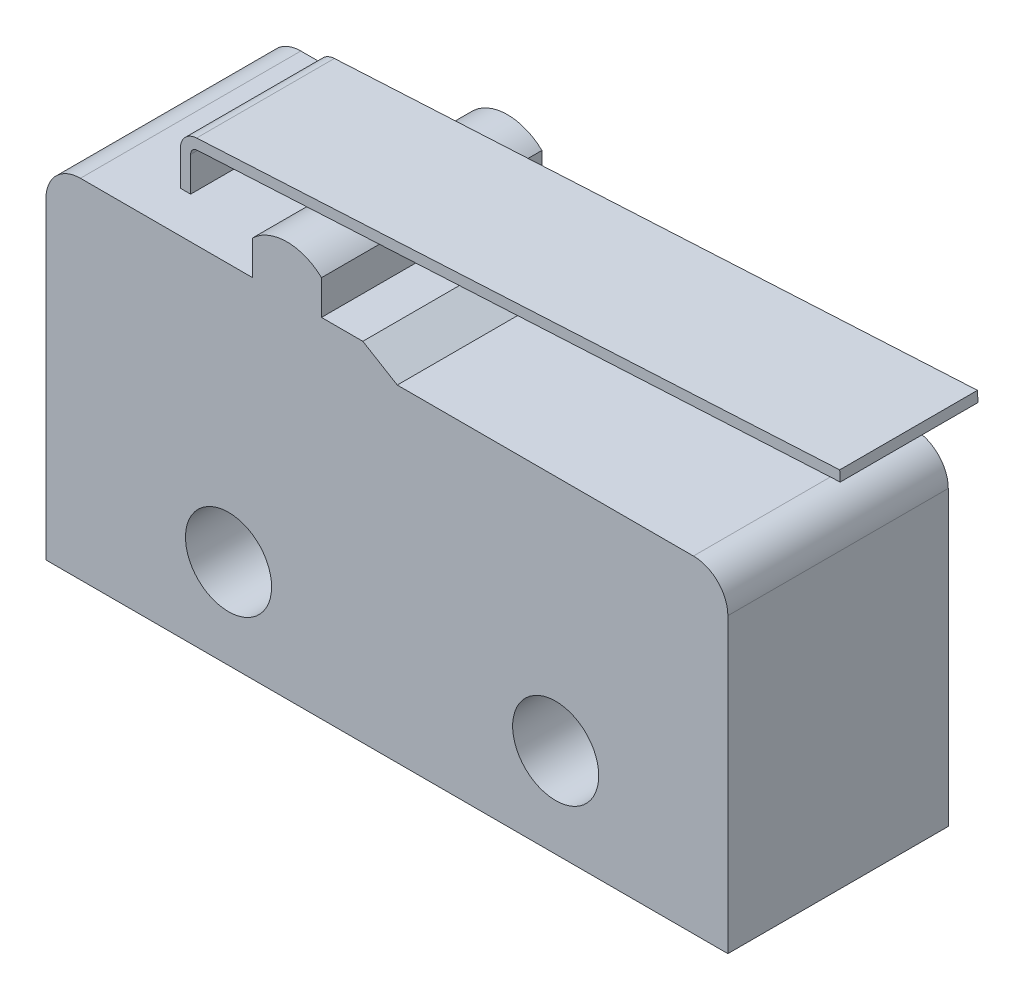
ISO-10303-21;
HEADER;
FILE_DESCRIPTION(('STEP AP214'),'2;1');
FILE_NAME('part.step','',(''),(''),'','','');
FILE_SCHEMA(('AUTOMOTIVE_DESIGN { 1 0 10303 214 1 1 1 1 }'));
ENDSEC;
DATA;
#1=APPLICATION_CONTEXT('core data for automotive mechanical design processes');
#2=APPLICATION_PROTOCOL_DEFINITION('international standard','automotive_design',2000,#1);
#3=PRODUCT_CONTEXT('',#1,'mechanical');
#4=PRODUCT('Part','Part','',(#3));
#5=PRODUCT_RELATED_PRODUCT_CATEGORY('part','',(#4));
#6=PRODUCT_DEFINITION_FORMATION('','',#4);
#7=PRODUCT_DEFINITION_CONTEXT('part definition',#1,'design');
#8=PRODUCT_DEFINITION('design','',#6,#7);
#9=PRODUCT_DEFINITION_SHAPE('','',#8);
#10=(LENGTH_UNIT() NAMED_UNIT(*) SI_UNIT(.MILLI.,.METRE.));
#11=(NAMED_UNIT(*) PLANE_ANGLE_UNIT() SI_UNIT($,.RADIAN.));
#12=(NAMED_UNIT(*) SI_UNIT($,.STERADIAN.) SOLID_ANGLE_UNIT());
#13=UNCERTAINTY_MEASURE_WITH_UNIT(LENGTH_MEASURE(1.E-05),#10,'distance_accuracy_value','');
#14=(GEOMETRIC_REPRESENTATION_CONTEXT(3) GLOBAL_UNCERTAINTY_ASSIGNED_CONTEXT((#13)) GLOBAL_UNIT_ASSIGNED_CONTEXT((#10,
#11,#12)) REPRESENTATION_CONTEXT('',''));
#15=CARTESIAN_POINT('',(0.,0.,0.));
#16=DIRECTION('',(0.,0.,1.));
#17=DIRECTION('',(1.,0.,0.));
#18=AXIS2_PLACEMENT_3D('',#15,#16,#17);
#19=CARTESIAN_POINT('',(-2.11060404683769,8.69971868763504,2.));
#20=DIRECTION('',(-0.0530202341884263,0.998593438175219,0.));
#21=DIRECTION('',(-0.998593438175219,-0.0530202341884263,0.));
#22=AXIS2_PLACEMENT_3D('',#19,#20,#21);
#23=PLANE('',#22);
#24=DIRECTION('',(0.998593438175219,0.0530202341884263,0.));
#25=VECTOR('',#24,1.);
#26=CARTESIAN_POINT('',(-2.11060404683769,8.69971868763504,-2.));
#27=LINE('',#26,#25);
#28=CARTESIAN_POINT('',(-2.11060404683769,8.69971868763504,-2.));
#29=VERTEX_POINT('',#28);
#30=CARTESIAN_POINT('',(16.5630932470389,9.69119706695862,-2.));
#31=VERTEX_POINT('',#30);
#32=EDGE_CURVE('E140',#29,#31,#27,.T.);
#33=ORIENTED_EDGE('',*,*,#32,.T.);
#34=DIRECTION('',(0.,0.,-1.));
#35=VECTOR('',#34,1.);
#36=CARTESIAN_POINT('',(16.5630932470389,9.69119706695862,2.));
#37=LINE('',#36,#35);
#38=CARTESIAN_POINT('',(16.5630932470389,9.69119706695862,2.));
#39=VERTEX_POINT('',#38);
#40=EDGE_CURVE('E12',#39,#31,#37,.T.);
#41=ORIENTED_EDGE('',*,*,#40,.F.);
#42=DIRECTION('',(0.998593438175219,0.0530202341884263,0.));
#43=VECTOR('',#42,1.);
#44=CARTESIAN_POINT('',(-2.11060404683769,8.69971868763504,2.));
#45=LINE('',#44,#43);
#46=CARTESIAN_POINT('',(-2.11060404683769,8.69971868763504,2.));
#47=VERTEX_POINT('',#46);
#48=EDGE_CURVE('E98',#47,#39,#45,.T.);
#49=ORIENTED_EDGE('',*,*,#48,.F.);
#50=DIRECTION('',(0.,0.,-1.));
#51=VECTOR('',#50,1.);
#52=CARTESIAN_POINT('',(-2.11060404683769,8.69971868763504,2.));
#53=LINE('',#52,#51);
#54=EDGE_CURVE('E139',#47,#29,#53,.T.);
#55=ORIENTED_EDGE('',*,*,#54,.T.);
#56=EDGE_LOOP('',(#33,#41,#49,#55));
#57=FACE_BOUND('',#56,.T.);
#58=ADVANCED_FACE('F43',(#57),#23,.F.);
#59=CARTESIAN_POINT('',(16.5471871767824,9.99077509841118,2.));
#60=DIRECTION('',(0.99859343817522,0.0530202341883963,0.));
#61=DIRECTION('',(-0.0530202341883963,0.99859343817522,0.));
#62=AXIS2_PLACEMENT_3D('',#59,#60,#61);
#63=PLANE('',#62);
#64=DIRECTION('',(0.0530202341883963,-0.99859343817522,0.));
#65=VECTOR('',#64,1.);
#66=CARTESIAN_POINT('',(16.5471871767824,9.99077509841118,-2.));
#67=LINE('',#66,#65);
#68=CARTESIAN_POINT('',(16.5471871767824,9.99077509841118,-2.));
#69=VERTEX_POINT('',#68);
#70=EDGE_CURVE('E143',#69,#31,#67,.T.);
#71=ORIENTED_EDGE('',*,*,#70,.F.);
#72=DIRECTION('',(0.,0.,-1.));
#73=VECTOR('',#72,1.);
#74=CARTESIAN_POINT('',(16.5471871767824,9.99077509841118,2.));
#75=LINE('',#74,#73);
#76=CARTESIAN_POINT('',(16.5471871767824,9.99077509841118,2.));
#77=VERTEX_POINT('',#76);
#78=EDGE_CURVE('E51',#77,#69,#75,.T.);
#79=ORIENTED_EDGE('',*,*,#78,.F.);
#80=DIRECTION('',(0.0530202341883963,-0.99859343817522,0.));
#81=VECTOR('',#80,1.);
#82=CARTESIAN_POINT('',(16.5471871767824,9.99077509841118,2.));
#83=LINE('',#82,#81);
#84=EDGE_CURVE('E182',#77,#39,#83,.T.);
#85=ORIENTED_EDGE('',*,*,#84,.T.);
#86=ORIENTED_EDGE('',*,*,#40,.T.);
#87=EDGE_LOOP('',(#71,#79,#85,#86));
#88=FACE_BOUND('',#87,.T.);
#89=ADVANCED_FACE('F173',(#88),#63,.T.);
#90=CARTESIAN_POINT('',(-2.12651011709421,8.99929671908761,2.));
#91=DIRECTION('',(-0.0530202341884263,0.998593438175219,0.));
#92=DIRECTION('',(-0.998593438175219,-0.0530202341884263,0.));
#93=AXIS2_PLACEMENT_3D('',#90,#91,#92);
#94=PLANE('',#93);
#95=DIRECTION('',(0.998593438175219,0.0530202341884263,0.));
#96=VECTOR('',#95,1.);
#97=CARTESIAN_POINT('',(-2.12651011709421,8.99929671908761,-2.));
#98=LINE('',#97,#96);
#99=CARTESIAN_POINT('',(-2.12651011709421,8.99929671908761,-2.));
#100=VERTEX_POINT('',#99);
#101=EDGE_CURVE('E146',#100,#69,#98,.T.);
#102=ORIENTED_EDGE('',*,*,#101,.F.);
#103=DIRECTION('',(0.,0.,-1.));
#104=VECTOR('',#103,1.);
#105=CARTESIAN_POINT('',(-2.12651011709421,8.99929671908761,2.));
#106=LINE('',#105,#104);
#107=CARTESIAN_POINT('',(-2.12651011709421,8.99929671908761,2.));
#108=VERTEX_POINT('',#107);
#109=EDGE_CURVE('E163',#108,#100,#106,.T.);
#110=ORIENTED_EDGE('',*,*,#109,.F.);
#111=DIRECTION('',(0.998593438175219,0.0530202341884263,0.));
#112=VECTOR('',#111,1.);
#113=CARTESIAN_POINT('',(-2.12651011709421,8.99929671908761,2.));
#114=LINE('',#113,#112);
#115=EDGE_CURVE('E170',#108,#77,#114,.T.);
#116=ORIENTED_EDGE('',*,*,#115,.T.);
#117=ORIENTED_EDGE('',*,*,#78,.T.);
#118=EDGE_LOOP('',(#102,#110,#116,#117));
#119=FACE_BOUND('',#118,.T.);
#120=ADVANCED_FACE('F168',(#119),#94,.T.);
#121=CARTESIAN_POINT('',(-2.1,8.5,2.));
#122=DIRECTION('',(0.,0.,-1.));
#123=DIRECTION('',(-1.,0.,0.));
#124=AXIS2_PLACEMENT_3D('',#121,#122,#123);
#125=CYLINDRICAL_SURFACE('',#124,0.5);
#126=CARTESIAN_POINT('',(-2.1,8.5,-2.));
#127=DIRECTION('',(0.,0.,1.));
#128=DIRECTION('',(1.,0.,0.));
#129=AXIS2_PLACEMENT_3D('',#126,#127,#128);
#130=CIRCLE('',#129,0.5);
#131=CARTESIAN_POINT('',(-2.6,8.5,-2.));
#132=VERTEX_POINT('',#131);
#133=EDGE_CURVE('E149',#132,#100,#130,.F.);
#134=ORIENTED_EDGE('',*,*,#133,.F.);
#135=DIRECTION('',(0.,0.,-1.));
#136=VECTOR('',#135,1.);
#137=CARTESIAN_POINT('',(-2.6,8.5,2.));
#138=LINE('',#137,#136);
#139=CARTESIAN_POINT('',(-2.6,8.5,2.));
#140=VERTEX_POINT('',#139);
#141=EDGE_CURVE('E161',#140,#132,#138,.T.);
#142=ORIENTED_EDGE('',*,*,#141,.F.);
#143=CARTESIAN_POINT('',(-2.1,8.5,2.));
#144=DIRECTION('',(0.,0.,1.));
#145=DIRECTION('',(1.,0.,0.));
#146=AXIS2_PLACEMENT_3D('',#143,#144,#145);
#147=CIRCLE('',#146,0.5);
#148=EDGE_CURVE('E134',#140,#108,#147,.F.);
#149=ORIENTED_EDGE('',*,*,#148,.T.);
#150=ORIENTED_EDGE('',*,*,#109,.T.);
#151=EDGE_LOOP('',(#134,#142,#149,#150));
#152=FACE_BOUND('',#151,.T.);
#153=ADVANCED_FACE('F180',(#152),#125,.T.);
#154=CARTESIAN_POINT('',(-2.6,7.5,2.));
#155=DIRECTION('',(-1.,0.,0.));
#156=DIRECTION('',(0.,0.,1.));
#157=AXIS2_PLACEMENT_3D('',#154,#155,#156);
#158=PLANE('',#157);
#159=DIRECTION('',(0.,1.,0.));
#160=VECTOR('',#159,1.);
#161=CARTESIAN_POINT('',(-2.6,7.5,-2.));
#162=LINE('',#161,#160);
#163=CARTESIAN_POINT('',(-2.6,7.5,-2.));
#164=VERTEX_POINT('',#163);
#165=EDGE_CURVE('E152',#164,#132,#162,.T.);
#166=ORIENTED_EDGE('',*,*,#165,.F.);
#167=DIRECTION('',(0.,0.,-1.));
#168=VECTOR('',#167,1.);
#169=CARTESIAN_POINT('',(-2.6,7.5,2.));
#170=LINE('',#169,#168);
#171=CARTESIAN_POINT('',(-2.6,7.5,2.));
#172=VERTEX_POINT('',#171);
#173=EDGE_CURVE('E122',#172,#164,#170,.T.);
#174=ORIENTED_EDGE('',*,*,#173,.F.);
#175=DIRECTION('',(0.,1.,0.));
#176=VECTOR('',#175,1.);
#177=CARTESIAN_POINT('',(-2.6,7.5,2.));
#178=LINE('',#177,#176);
#179=EDGE_CURVE('E132',#172,#140,#178,.T.);
#180=ORIENTED_EDGE('',*,*,#179,.T.);
#181=ORIENTED_EDGE('',*,*,#141,.T.);
#182=EDGE_LOOP('',(#166,#174,#180,#181));
#183=FACE_BOUND('',#182,.T.);
#184=ADVANCED_FACE('F187',(#183),#158,.T.);
#185=CARTESIAN_POINT('',(-2.3,7.5,2.));
#186=DIRECTION('',(0.,-1.,0.));
#187=DIRECTION('',(0.,0.,-1.));
#188=AXIS2_PLACEMENT_3D('',#185,#186,#187);
#189=PLANE('',#188);
#190=DIRECTION('',(-1.,0.,0.));
#191=VECTOR('',#190,1.);
#192=CARTESIAN_POINT('',(-2.3,7.5,-2.));
#193=LINE('',#192,#191);
#194=CARTESIAN_POINT('',(-2.3,7.5,-2.));
#195=VERTEX_POINT('',#194);
#196=EDGE_CURVE('E121',#195,#164,#193,.T.);
#197=ORIENTED_EDGE('',*,*,#196,.F.);
#198=DIRECTION('',(0.,0.,-1.));
#199=VECTOR('',#198,1.);
#200=CARTESIAN_POINT('',(-2.3,7.5,2.));
#201=LINE('',#200,#199);
#202=CARTESIAN_POINT('',(-2.3,7.5,2.));
#203=VERTEX_POINT('',#202);
#204=EDGE_CURVE('E115',#203,#195,#201,.T.);
#205=ORIENTED_EDGE('',*,*,#204,.F.);
#206=DIRECTION('',(-1.,0.,0.));
#207=VECTOR('',#206,1.);
#208=CARTESIAN_POINT('',(-2.3,7.5,2.));
#209=LINE('',#208,#207);
#210=EDGE_CURVE('E119',#203,#172,#209,.T.);
#211=ORIENTED_EDGE('',*,*,#210,.T.);
#212=ORIENTED_EDGE('',*,*,#173,.T.);
#213=EDGE_LOOP('',(#197,#205,#211,#212));
#214=FACE_BOUND('',#213,.T.);
#215=ADVANCED_FACE('F117',(#214),#189,.T.);
#216=CARTESIAN_POINT('',(-2.3,7.5,2.));
#217=DIRECTION('',(-1.,0.,0.));
#218=DIRECTION('',(0.,0.,1.));
#219=AXIS2_PLACEMENT_3D('',#216,#217,#218);
#220=PLANE('',#219);
#221=DIRECTION('',(0.,1.,0.));
#222=VECTOR('',#221,1.);
#223=CARTESIAN_POINT('',(-2.3,7.5,-2.));
#224=LINE('',#223,#222);
#225=CARTESIAN_POINT('',(-2.3,8.5,-2.));
#226=VERTEX_POINT('',#225);
#227=EDGE_CURVE('E86',#195,#226,#224,.T.);
#228=ORIENTED_EDGE('',*,*,#227,.T.);
#229=DIRECTION('',(0.,0.,-1.));
#230=VECTOR('',#229,1.);
#231=CARTESIAN_POINT('',(-2.3,8.5,2.));
#232=LINE('',#231,#230);
#233=CARTESIAN_POINT('',(-2.3,8.5,2.));
#234=VERTEX_POINT('',#233);
#235=EDGE_CURVE('E123',#234,#226,#232,.T.);
#236=ORIENTED_EDGE('',*,*,#235,.F.);
#237=DIRECTION('',(0.,1.,0.));
#238=VECTOR('',#237,1.);
#239=CARTESIAN_POINT('',(-2.3,7.5,2.));
#240=LINE('',#239,#238);
#241=EDGE_CURVE('E125',#203,#234,#240,.T.);
#242=ORIENTED_EDGE('',*,*,#241,.F.);
#243=ORIENTED_EDGE('',*,*,#204,.T.);
#244=EDGE_LOOP('',(#228,#236,#242,#243));
#245=FACE_BOUND('',#244,.T.);
#246=ADVANCED_FACE('F126',(#245),#220,.F.);
#247=CARTESIAN_POINT('',(-2.1,8.5,2.));
#248=DIRECTION('',(0.,0.,-1.));
#249=DIRECTION('',(-1.,0.,0.));
#250=AXIS2_PLACEMENT_3D('',#247,#248,#249);
#251=CYLINDRICAL_SURFACE('',#250,0.2);
#252=CARTESIAN_POINT('',(-2.1,8.5,-2.));
#253=DIRECTION('',(0.,0.,-1.));
#254=DIRECTION('',(-1.,0.,0.));
#255=AXIS2_PLACEMENT_3D('',#252,#253,#254);
#256=CIRCLE('',#255,0.2);
#257=EDGE_CURVE('E92',#226,#29,#256,.T.);
#258=ORIENTED_EDGE('',*,*,#257,.T.);
#259=ORIENTED_EDGE('',*,*,#54,.F.);
#260=CARTESIAN_POINT('',(-2.1,8.5,2.));
#261=DIRECTION('',(0.,0.,-1.));
#262=DIRECTION('',(-1.,0.,0.));
#263=AXIS2_PLACEMENT_3D('',#260,#261,#262);
#264=CIRCLE('',#263,0.2);
#265=EDGE_CURVE('E59',#234,#47,#264,.T.);
#266=ORIENTED_EDGE('',*,*,#265,.F.);
#267=ORIENTED_EDGE('',*,*,#235,.T.);
#268=EDGE_LOOP('',(#258,#259,#266,#267));
#269=FACE_BOUND('',#268,.T.);
#270=ADVANCED_FACE('F189',(#269),#251,.F.);
#271=CARTESIAN_POINT('',(-2.1,8.5,2.));
#272=DIRECTION('',(0.,0.,1.));
#273=DIRECTION('',(1.,0.,0.));
#274=AXIS2_PLACEMENT_3D('',#271,#272,#273);
#275=PLANE('',#274);
#276=ORIENTED_EDGE('',*,*,#48,.T.);
#277=ORIENTED_EDGE('',*,*,#84,.F.);
#278=ORIENTED_EDGE('',*,*,#115,.F.);
#279=ORIENTED_EDGE('',*,*,#148,.F.);
#280=ORIENTED_EDGE('',*,*,#179,.F.);
#281=ORIENTED_EDGE('',*,*,#210,.F.);
#282=ORIENTED_EDGE('',*,*,#241,.T.);
#283=ORIENTED_EDGE('',*,*,#265,.T.);
#284=EDGE_LOOP('',(#276,#277,#278,#279,#280,#281,#282,#283));
#285=FACE_BOUND('',#284,.T.);
#286=ADVANCED_FACE('F129',(#285),#275,.T.);
#287=CARTESIAN_POINT('',(-2.1,8.5,-2.));
#288=DIRECTION('',(0.,0.,1.));
#289=DIRECTION('',(1.,0.,0.));
#290=AXIS2_PLACEMENT_3D('',#287,#288,#289);
#291=PLANE('',#290);
#292=ORIENTED_EDGE('',*,*,#32,.F.);
#293=ORIENTED_EDGE('',*,*,#257,.F.);
#294=ORIENTED_EDGE('',*,*,#227,.F.);
#295=ORIENTED_EDGE('',*,*,#196,.T.);
#296=ORIENTED_EDGE('',*,*,#165,.T.);
#297=ORIENTED_EDGE('',*,*,#133,.T.);
#298=ORIENTED_EDGE('',*,*,#101,.T.);
#299=ORIENTED_EDGE('',*,*,#70,.T.);
#300=EDGE_LOOP('',(#292,#293,#294,#295,#296,#297,#298,#299));
#301=FACE_BOUND('',#300,.T.);
#302=ADVANCED_FACE('F176',(#301),#291,.F.);
#303=CLOSED_SHELL('',(#58,#89,#120,#153,#184,#215,#246,#270,#286,#302));
#304=MANIFOLD_SOLID_BREP('B2',#303);
#305=CARTESIAN_POINT('',(13.5,5.9,3.2));
#306=DIRECTION('',(0.,0.,1.));
#307=DIRECTION('',(1.,0.,0.));
#308=AXIS2_PLACEMENT_3D('',#305,#306,#307);
#309=PLANE('',#308);
#310=CARTESIAN_POINT('',(0.,0.,3.2));
#311=DIRECTION('',(0.,0.,1.));
#312=DIRECTION('',(1.,0.,0.));
#313=AXIS2_PLACEMENT_3D('',#310,#311,#312);
#314=CIRCLE('',#313,1.25);
#315=CARTESIAN_POINT('',(1.25,0.,3.2));
#316=VERTEX_POINT('',#315);
#317=EDGE_CURVE('E396',#316,#316,#314,.T.);
#318=ORIENTED_EDGE('',*,*,#317,.F.);
#319=EDGE_LOOP('',(#318));
#320=FACE_BOUND('',#319,.T.);
#321=DIRECTION('',(0.,1.,0.));
#322=VECTOR('',#321,1.);
#323=CARTESIAN_POINT('',(14.5,-2.6,3.2));
#324=LINE('',#323,#322);
#325=CARTESIAN_POINT('',(14.5,-2.6,3.2));
#326=VERTEX_POINT('',#325);
#327=CARTESIAN_POINT('',(14.5,5.9,3.2));
#328=VERTEX_POINT('',#327);
#329=EDGE_CURVE('E415',#326,#328,#324,.T.);
#330=ORIENTED_EDGE('',*,*,#329,.T.);
#331=CARTESIAN_POINT('',(13.5,5.9,3.2));
#332=DIRECTION('',(0.,0.,1.));
#333=DIRECTION('',(1.,0.,0.));
#334=AXIS2_PLACEMENT_3D('',#331,#332,#333);
#335=CIRCLE('',#334,1.);
#336=CARTESIAN_POINT('',(13.5,6.9,3.2));
#337=VERTEX_POINT('',#336);
#338=EDGE_CURVE('E343',#328,#337,#335,.T.);
#339=ORIENTED_EDGE('',*,*,#338,.T.);
#340=DIRECTION('',(-1.,0.,0.));
#341=VECTOR('',#340,1.);
#342=CARTESIAN_POINT('',(13.5,6.9,3.2));
#343=LINE('',#342,#341);
#344=CARTESIAN_POINT('',(4.9,6.9,3.2));
#345=VERTEX_POINT('',#344);
#346=EDGE_CURVE('E442',#337,#345,#343,.T.);
#347=ORIENTED_EDGE('',*,*,#346,.T.);
#348=DIRECTION('',(-0.857492925712544,0.514495755427527,0.));
#349=VECTOR('',#348,1.);
#350=CARTESIAN_POINT('',(4.9,6.9,3.2));
#351=LINE('',#350,#349);
#352=CARTESIAN_POINT('',(3.9,7.5,3.2));
#353=VERTEX_POINT('',#352);
#354=EDGE_CURVE('E461',#345,#353,#351,.T.);
#355=ORIENTED_EDGE('',*,*,#354,.T.);
#356=DIRECTION('',(-1.,0.,0.));
#357=VECTOR('',#356,1.);
#358=CARTESIAN_POINT('',(3.9,7.5,3.2));
#359=LINE('',#358,#357);
#360=CARTESIAN_POINT('',(2.7,7.5,3.2));
#361=VERTEX_POINT('',#360);
#362=EDGE_CURVE('E458',#353,#361,#359,.T.);
#363=ORIENTED_EDGE('',*,*,#362,.T.);
#364=DIRECTION('',(0.,1.,0.));
#365=VECTOR('',#364,1.);
#366=CARTESIAN_POINT('',(2.7,7.5,3.2));
#367=LINE('',#366,#365);
#368=CARTESIAN_POINT('',(2.7,8.5,3.2));
#369=VERTEX_POINT('',#368);
#370=EDGE_CURVE('E460',#361,#369,#367,.T.);
#371=ORIENTED_EDGE('',*,*,#370,.T.);
#372=CARTESIAN_POINT('',(1.7,7.45,3.2));
#373=DIRECTION('',(0.,0.,1.));
#374=DIRECTION('',(1.,0.,0.));
#375=AXIS2_PLACEMENT_3D('',#372,#373,#374);
#376=CIRCLE('',#375,1.45);
#377=CARTESIAN_POINT('',(0.699999999999999,8.5,3.2));
#378=VERTEX_POINT('',#377);
#379=EDGE_CURVE('E463',#369,#378,#376,.T.);
#380=ORIENTED_EDGE('',*,*,#379,.T.);
#381=DIRECTION('',(0.,-1.,0.));
#382=VECTOR('',#381,1.);
#383=CARTESIAN_POINT('',(0.699999999999999,8.5,3.2));
#384=LINE('',#383,#382);
#385=CARTESIAN_POINT('',(0.699999999999999,7.5,3.2));
#386=VERTEX_POINT('',#385);
#387=EDGE_CURVE('E469',#378,#386,#384,.T.);
#388=ORIENTED_EDGE('',*,*,#387,.T.);
#389=DIRECTION('',(-1.,0.,0.));
#390=VECTOR('',#389,1.);
#391=CARTESIAN_POINT('',(0.699999999999999,7.5,3.2));
#392=LINE('',#391,#390);
#393=CARTESIAN_POINT('',(-4.3,7.5,3.2));
#394=VERTEX_POINT('',#393);
#395=EDGE_CURVE('E374',#386,#394,#392,.T.);
#396=ORIENTED_EDGE('',*,*,#395,.T.);
#397=CARTESIAN_POINT('',(-4.3,6.5,3.2));
#398=DIRECTION('',(0.,0.,1.));
#399=DIRECTION('',(1.,0.,0.));
#400=AXIS2_PLACEMENT_3D('',#397,#398,#399);
#401=CIRCLE('',#400,1.);
#402=CARTESIAN_POINT('',(-5.3,6.5,3.2));
#403=VERTEX_POINT('',#402);
#404=EDGE_CURVE('E368',#394,#403,#401,.T.);
#405=ORIENTED_EDGE('',*,*,#404,.T.);
#406=DIRECTION('',(0.,-1.,0.));
#407=VECTOR('',#406,1.);
#408=CARTESIAN_POINT('',(-5.3,6.5,3.2));
#409=LINE('',#408,#407);
#410=CARTESIAN_POINT('',(-5.3,-2.6,3.2));
#411=VERTEX_POINT('',#410);
#412=EDGE_CURVE('E372',#403,#411,#409,.T.);
#413=ORIENTED_EDGE('',*,*,#412,.T.);
#414=DIRECTION('',(1.,0.,0.));
#415=VECTOR('',#414,1.);
#416=CARTESIAN_POINT('',(-5.3,-2.6,3.2));
#417=LINE('',#416,#415);
#418=EDGE_CURVE('E288',#411,#326,#417,.T.);
#419=ORIENTED_EDGE('',*,*,#418,.T.);
#420=EDGE_LOOP('',(#330,#339,#347,#355,#363,#371,#380,#388,#396,#405,#413,#419));
#421=FACE_BOUND('',#420,.T.);
#422=CARTESIAN_POINT('',(9.5,0.,3.2));
#423=DIRECTION('',(0.,0.,1.));
#424=DIRECTION('',(1.,0.,0.));
#425=AXIS2_PLACEMENT_3D('',#422,#423,#424);
#426=CIRCLE('',#425,1.25);
#427=CARTESIAN_POINT('',(10.75,0.,3.2));
#428=VERTEX_POINT('',#427);
#429=EDGE_CURVE('E512',#428,#428,#426,.T.);
#430=ORIENTED_EDGE('',*,*,#429,.F.);
#431=EDGE_LOOP('',(#430));
#432=FACE_BOUND('',#431,.T.);
#433=ADVANCED_FACE('F271',(#320,#421,#432),#309,.T.);
#434=CARTESIAN_POINT('',(13.5,5.9,-3.2));
#435=DIRECTION('',(0.,0.,1.));
#436=DIRECTION('',(1.,0.,0.));
#437=AXIS2_PLACEMENT_3D('',#434,#435,#436);
#438=PLANE('',#437);
#439=CARTESIAN_POINT('',(0.,0.,-3.2));
#440=DIRECTION('',(0.,0.,1.));
#441=DIRECTION('',(1.,0.,0.));
#442=AXIS2_PLACEMENT_3D('',#439,#440,#441);
#443=CIRCLE('',#442,1.25);
#444=CARTESIAN_POINT('',(1.25,0.,-3.2));
#445=VERTEX_POINT('',#444);
#446=EDGE_CURVE('E517',#445,#445,#443,.T.);
#447=ORIENTED_EDGE('',*,*,#446,.T.);
#448=EDGE_LOOP('',(#447));
#449=FACE_BOUND('',#448,.T.);
#450=DIRECTION('',(0.,1.,0.));
#451=VECTOR('',#450,1.);
#452=CARTESIAN_POINT('',(14.5,-2.6,-3.2));
#453=LINE('',#452,#451);
#454=CARTESIAN_POINT('',(14.5,-2.6,-3.2));
#455=VERTEX_POINT('',#454);
#456=CARTESIAN_POINT('',(14.5,5.9,-3.2));
#457=VERTEX_POINT('',#456);
#458=EDGE_CURVE('E392',#455,#457,#453,.T.);
#459=ORIENTED_EDGE('',*,*,#458,.F.);
#460=DIRECTION('',(1.,0.,0.));
#461=VECTOR('',#460,1.);
#462=CARTESIAN_POINT('',(-5.3,-2.6,-3.2));
#463=LINE('',#462,#461);
#464=CARTESIAN_POINT('',(-5.3,-2.6,-3.2));
#465=VERTEX_POINT('',#464);
#466=EDGE_CURVE('E335',#465,#455,#463,.T.);
#467=ORIENTED_EDGE('',*,*,#466,.F.);
#468=DIRECTION('',(0.,-1.,0.));
#469=VECTOR('',#468,1.);
#470=CARTESIAN_POINT('',(-5.3,6.5,-3.2));
#471=LINE('',#470,#469);
#472=CARTESIAN_POINT('',(-5.3,6.5,-3.2));
#473=VERTEX_POINT('',#472);
#474=EDGE_CURVE('E329',#473,#465,#471,.T.);
#475=ORIENTED_EDGE('',*,*,#474,.F.);
#476=CARTESIAN_POINT('',(-4.3,6.5,-3.2));
#477=DIRECTION('',(0.,0.,1.));
#478=DIRECTION('',(1.,0.,0.));
#479=AXIS2_PLACEMENT_3D('',#476,#477,#478);
#480=CIRCLE('',#479,1.);
#481=CARTESIAN_POINT('',(-4.3,7.5,-3.2));
#482=VERTEX_POINT('',#481);
#483=EDGE_CURVE('E382',#482,#473,#480,.T.);
#484=ORIENTED_EDGE('',*,*,#483,.F.);
#485=DIRECTION('',(-1.,0.,0.));
#486=VECTOR('',#485,1.);
#487=CARTESIAN_POINT('',(0.699999999999999,7.5,-3.2));
#488=LINE('',#487,#486);
#489=CARTESIAN_POINT('',(0.699999999999999,7.5,-3.2));
#490=VERTEX_POINT('',#489);
#491=EDGE_CURVE('E410',#490,#482,#488,.T.);
#492=ORIENTED_EDGE('',*,*,#491,.F.);
#493=DIRECTION('',(0.,-1.,0.));
#494=VECTOR('',#493,1.);
#495=CARTESIAN_POINT('',(0.699999999999999,8.5,-3.2));
#496=LINE('',#495,#494);
#497=CARTESIAN_POINT('',(0.699999999999999,8.5,-3.2));
#498=VERTEX_POINT('',#497);
#499=EDGE_CURVE('E408',#498,#490,#496,.T.);
#500=ORIENTED_EDGE('',*,*,#499,.F.);
#501=CARTESIAN_POINT('',(1.7,7.45,-3.2));
#502=DIRECTION('',(0.,0.,1.));
#503=DIRECTION('',(1.,0.,0.));
#504=AXIS2_PLACEMENT_3D('',#501,#502,#503);
#505=CIRCLE('',#504,1.45);
#506=CARTESIAN_POINT('',(2.7,8.5,-3.2));
#507=VERTEX_POINT('',#506);
#508=EDGE_CURVE('E406',#507,#498,#505,.T.);
#509=ORIENTED_EDGE('',*,*,#508,.F.);
#510=DIRECTION('',(0.,1.,0.));
#511=VECTOR('',#510,1.);
#512=CARTESIAN_POINT('',(2.7,7.5,-3.2));
#513=LINE('',#512,#511);
#514=CARTESIAN_POINT('',(2.7,7.5,-3.2));
#515=VERTEX_POINT('',#514);
#516=EDGE_CURVE('E404',#515,#507,#513,.T.);
#517=ORIENTED_EDGE('',*,*,#516,.F.);
#518=DIRECTION('',(-1.,0.,0.));
#519=VECTOR('',#518,1.);
#520=CARTESIAN_POINT('',(3.9,7.5,-3.2));
#521=LINE('',#520,#519);
#522=CARTESIAN_POINT('',(3.9,7.5,-3.2));
#523=VERTEX_POINT('',#522);
#524=EDGE_CURVE('E402',#523,#515,#521,.T.);
#525=ORIENTED_EDGE('',*,*,#524,.F.);
#526=DIRECTION('',(-0.857492925712544,0.514495755427527,0.));
#527=VECTOR('',#526,1.);
#528=CARTESIAN_POINT('',(4.9,6.9,-3.2));
#529=LINE('',#528,#527);
#530=CARTESIAN_POINT('',(4.9,6.9,-3.2));
#531=VERTEX_POINT('',#530);
#532=EDGE_CURVE('E400',#531,#523,#529,.T.);
#533=ORIENTED_EDGE('',*,*,#532,.F.);
#534=DIRECTION('',(-1.,0.,0.));
#535=VECTOR('',#534,1.);
#536=CARTESIAN_POINT('',(13.5,6.9,-3.2));
#537=LINE('',#536,#535);
#538=CARTESIAN_POINT('',(13.5,6.9,-3.2));
#539=VERTEX_POINT('',#538);
#540=EDGE_CURVE('E398',#539,#531,#537,.T.);
#541=ORIENTED_EDGE('',*,*,#540,.F.);
#542=CARTESIAN_POINT('',(13.5,5.9,-3.2));
#543=DIRECTION('',(0.,0.,1.));
#544=DIRECTION('',(1.,0.,0.));
#545=AXIS2_PLACEMENT_3D('',#542,#543,#544);
#546=CIRCLE('',#545,1.);
#547=EDGE_CURVE('E395',#457,#539,#546,.T.);
#548=ORIENTED_EDGE('',*,*,#547,.F.);
#549=EDGE_LOOP('',(#459,#467,#475,#484,#492,#500,#509,#517,#525,#533,#541,#548));
#550=FACE_BOUND('',#549,.T.);
#551=CARTESIAN_POINT('',(9.5,0.,-3.2));
#552=DIRECTION('',(0.,0.,1.));
#553=DIRECTION('',(1.,0.,0.));
#554=AXIS2_PLACEMENT_3D('',#551,#552,#553);
#555=CIRCLE('',#554,1.25);
#556=CARTESIAN_POINT('',(10.75,0.,-3.2));
#557=VERTEX_POINT('',#556);
#558=EDGE_CURVE('E515',#557,#557,#555,.T.);
#559=ORIENTED_EDGE('',*,*,#558,.T.);
#560=EDGE_LOOP('',(#559));
#561=FACE_BOUND('',#560,.T.);
#562=ADVANCED_FACE('F446',(#449,#550,#561),#438,.F.);
#563=CARTESIAN_POINT('',(14.5,-2.6,3.2));
#564=DIRECTION('',(-1.,0.,0.));
#565=DIRECTION('',(0.,0.,1.));
#566=AXIS2_PLACEMENT_3D('',#563,#564,#565);
#567=PLANE('',#566);
#568=ORIENTED_EDGE('',*,*,#458,.T.);
#569=DIRECTION('',(0.,0.,-1.));
#570=VECTOR('',#569,1.);
#571=CARTESIAN_POINT('',(14.5,5.9,3.2));
#572=LINE('',#571,#570);
#573=EDGE_CURVE('E41',#328,#457,#572,.T.);
#574=ORIENTED_EDGE('',*,*,#573,.F.);
#575=ORIENTED_EDGE('',*,*,#329,.F.);
#576=DIRECTION('',(0.,0.,-1.));
#577=VECTOR('',#576,1.);
#578=CARTESIAN_POINT('',(14.5,-2.6,3.2));
#579=LINE('',#578,#577);
#580=EDGE_CURVE('E388',#326,#455,#579,.T.);
#581=ORIENTED_EDGE('',*,*,#580,.T.);
#582=EDGE_LOOP('',(#568,#574,#575,#581));
#583=FACE_BOUND('',#582,.T.);
#584=ADVANCED_FACE('F273',(#583),#567,.F.);
#585=CARTESIAN_POINT('',(13.5,5.9,3.2));
#586=DIRECTION('',(0.,0.,-1.));
#587=DIRECTION('',(-1.,0.,0.));
#588=AXIS2_PLACEMENT_3D('',#585,#586,#587);
#589=CYLINDRICAL_SURFACE('',#588,1.);
#590=ORIENTED_EDGE('',*,*,#547,.T.);
#591=DIRECTION('',(0.,0.,-1.));
#592=VECTOR('',#591,1.);
#593=CARTESIAN_POINT('',(13.5,6.9,3.2));
#594=LINE('',#593,#592);
#595=EDGE_CURVE('E280',#337,#539,#594,.T.);
#596=ORIENTED_EDGE('',*,*,#595,.F.);
#597=ORIENTED_EDGE('',*,*,#338,.F.);
#598=ORIENTED_EDGE('',*,*,#573,.T.);
#599=EDGE_LOOP('',(#590,#596,#597,#598));
#600=FACE_BOUND('',#599,.T.);
#601=ADVANCED_FACE('F610',(#600),#589,.T.);
#602=CARTESIAN_POINT('',(13.5,6.9,3.2));
#603=DIRECTION('',(0.,-1.,0.));
#604=DIRECTION('',(0.,0.,-1.));
#605=AXIS2_PLACEMENT_3D('',#602,#603,#604);
#606=PLANE('',#605);
#607=ORIENTED_EDGE('',*,*,#540,.T.);
#608=DIRECTION('',(0.,0.,-1.));
#609=VECTOR('',#608,1.);
#610=CARTESIAN_POINT('',(4.9,6.9,3.2));
#611=LINE('',#610,#609);
#612=EDGE_CURVE('E434',#345,#531,#611,.T.);
#613=ORIENTED_EDGE('',*,*,#612,.F.);
#614=ORIENTED_EDGE('',*,*,#346,.F.);
#615=ORIENTED_EDGE('',*,*,#595,.T.);
#616=EDGE_LOOP('',(#607,#613,#614,#615));
#617=FACE_BOUND('',#616,.T.);
#618=ADVANCED_FACE('F440',(#617),#606,.F.);
#619=CARTESIAN_POINT('',(4.9,6.9,3.2));
#620=DIRECTION('',(-0.514495755427527,-0.857492925712544,0.));
#621=DIRECTION('',(0.857492925712544,-0.514495755427527,0.));
#622=AXIS2_PLACEMENT_3D('',#619,#620,#621);
#623=PLANE('',#622);
#624=ORIENTED_EDGE('',*,*,#532,.T.);
#625=DIRECTION('',(0.,0.,-1.));
#626=VECTOR('',#625,1.);
#627=CARTESIAN_POINT('',(3.9,7.5,3.2));
#628=LINE('',#627,#626);
#629=EDGE_CURVE('E431',#353,#523,#628,.T.);
#630=ORIENTED_EDGE('',*,*,#629,.F.);
#631=ORIENTED_EDGE('',*,*,#354,.F.);
#632=ORIENTED_EDGE('',*,*,#612,.T.);
#633=EDGE_LOOP('',(#624,#630,#631,#632));
#634=FACE_BOUND('',#633,.T.);
#635=ADVANCED_FACE('F452',(#634),#623,.F.);
#636=CARTESIAN_POINT('',(3.9,7.5,3.2));
#637=DIRECTION('',(0.,-1.,0.));
#638=DIRECTION('',(0.,0.,-1.));
#639=AXIS2_PLACEMENT_3D('',#636,#637,#638);
#640=PLANE('',#639);
#641=ORIENTED_EDGE('',*,*,#524,.T.);
#642=DIRECTION('',(0.,0.,-1.));
#643=VECTOR('',#642,1.);
#644=CARTESIAN_POINT('',(2.7,7.5,3.2));
#645=LINE('',#644,#643);
#646=EDGE_CURVE('E428',#361,#515,#645,.T.);
#647=ORIENTED_EDGE('',*,*,#646,.F.);
#648=ORIENTED_EDGE('',*,*,#362,.F.);
#649=ORIENTED_EDGE('',*,*,#629,.T.);
#650=EDGE_LOOP('',(#641,#647,#648,#649));
#651=FACE_BOUND('',#650,.T.);
#652=ADVANCED_FACE('F456',(#651),#640,.F.);
#653=CARTESIAN_POINT('',(2.7,7.5,3.2));
#654=DIRECTION('',(-1.,0.,0.));
#655=DIRECTION('',(0.,0.,1.));
#656=AXIS2_PLACEMENT_3D('',#653,#654,#655);
#657=PLANE('',#656);
#658=ORIENTED_EDGE('',*,*,#516,.T.);
#659=DIRECTION('',(0.,0.,-1.));
#660=VECTOR('',#659,1.);
#661=CARTESIAN_POINT('',(2.7,8.5,3.2));
#662=LINE('',#661,#660);
#663=EDGE_CURVE('E425',#369,#507,#662,.T.);
#664=ORIENTED_EDGE('',*,*,#663,.F.);
#665=ORIENTED_EDGE('',*,*,#370,.F.);
#666=ORIENTED_EDGE('',*,*,#646,.T.);
#667=EDGE_LOOP('',(#658,#664,#665,#666));
#668=FACE_BOUND('',#667,.T.);
#669=ADVANCED_FACE('F575',(#668),#657,.F.);
#670=CARTESIAN_POINT('',(1.7,7.45,3.2));
#671=DIRECTION('',(0.,0.,-1.));
#672=DIRECTION('',(-1.,0.,0.));
#673=AXIS2_PLACEMENT_3D('',#670,#671,#672);
#674=CYLINDRICAL_SURFACE('',#673,1.45);
#675=ORIENTED_EDGE('',*,*,#508,.T.);
#676=DIRECTION('',(0.,0.,-1.));
#677=VECTOR('',#676,1.);
#678=CARTESIAN_POINT('',(0.699999999999999,8.5,3.2));
#679=LINE('',#678,#677);
#680=EDGE_CURVE('E422',#378,#498,#679,.T.);
#681=ORIENTED_EDGE('',*,*,#680,.F.);
#682=ORIENTED_EDGE('',*,*,#379,.F.);
#683=ORIENTED_EDGE('',*,*,#663,.T.);
#684=EDGE_LOOP('',(#675,#681,#682,#683));
#685=FACE_BOUND('',#684,.T.);
#686=ADVANCED_FACE('F566',(#685),#674,.T.);
#687=CARTESIAN_POINT('',(0.699999999999999,8.5,3.2));
#688=DIRECTION('',(1.,0.,0.));
#689=DIRECTION('',(0.,1.,0.));
#690=AXIS2_PLACEMENT_3D('',#687,#688,#689);
#691=PLANE('',#690);
#692=ORIENTED_EDGE('',*,*,#499,.T.);
#693=DIRECTION('',(0.,0.,-1.));
#694=VECTOR('',#693,1.);
#695=CARTESIAN_POINT('',(0.699999999999999,7.5,3.2));
#696=LINE('',#695,#694);
#697=EDGE_CURVE('E419',#386,#490,#696,.T.);
#698=ORIENTED_EDGE('',*,*,#697,.F.);
#699=ORIENTED_EDGE('',*,*,#387,.F.);
#700=ORIENTED_EDGE('',*,*,#680,.T.);
#701=EDGE_LOOP('',(#692,#698,#699,#700));
#702=FACE_BOUND('',#701,.T.);
#703=ADVANCED_FACE('F475',(#702),#691,.F.);
#704=CARTESIAN_POINT('',(0.699999999999999,7.5,3.2));
#705=DIRECTION('',(0.,-1.,0.));
#706=DIRECTION('',(1.,0.,0.));
#707=AXIS2_PLACEMENT_3D('',#704,#705,#706);
#708=PLANE('',#707);
#709=ORIENTED_EDGE('',*,*,#491,.T.);
#710=DIRECTION('',(0.,0.,-1.));
#711=VECTOR('',#710,1.);
#712=CARTESIAN_POINT('',(-4.3,7.5,3.2));
#713=LINE('',#712,#711);
#714=EDGE_CURVE('E383',#394,#482,#713,.T.);
#715=ORIENTED_EDGE('',*,*,#714,.F.);
#716=ORIENTED_EDGE('',*,*,#395,.F.);
#717=ORIENTED_EDGE('',*,*,#697,.T.);
#718=EDGE_LOOP('',(#709,#715,#716,#717));
#719=FACE_BOUND('',#718,.T.);
#720=ADVANCED_FACE('F479',(#719),#708,.F.);
#721=CARTESIAN_POINT('',(-4.3,6.5,3.2));
#722=DIRECTION('',(0.,0.,-1.));
#723=DIRECTION('',(-1.,0.,0.));
#724=AXIS2_PLACEMENT_3D('',#721,#722,#723);
#725=CYLINDRICAL_SURFACE('',#724,1.);
#726=ORIENTED_EDGE('',*,*,#483,.T.);
#727=DIRECTION('',(0.,0.,-1.));
#728=VECTOR('',#727,1.);
#729=CARTESIAN_POINT('',(-5.3,6.5,3.2));
#730=LINE('',#729,#728);
#731=EDGE_CURVE('E379',#403,#473,#730,.T.);
#732=ORIENTED_EDGE('',*,*,#731,.F.);
#733=ORIENTED_EDGE('',*,*,#404,.F.);
#734=ORIENTED_EDGE('',*,*,#714,.T.);
#735=EDGE_LOOP('',(#726,#732,#733,#734));
#736=FACE_BOUND('',#735,.T.);
#737=ADVANCED_FACE('F380',(#736),#725,.T.);
#738=CARTESIAN_POINT('',(-5.3,6.5,3.2));
#739=DIRECTION('',(1.,0.,0.));
#740=DIRECTION('',(0.,1.,0.));
#741=AXIS2_PLACEMENT_3D('',#738,#739,#740);
#742=PLANE('',#741);
#743=ORIENTED_EDGE('',*,*,#474,.T.);
#744=DIRECTION('',(0.,0.,-1.));
#745=VECTOR('',#744,1.);
#746=CARTESIAN_POINT('',(-5.3,-2.6,3.2));
#747=LINE('',#746,#745);
#748=EDGE_CURVE('E384',#411,#465,#747,.T.);
#749=ORIENTED_EDGE('',*,*,#748,.F.);
#750=ORIENTED_EDGE('',*,*,#412,.F.);
#751=ORIENTED_EDGE('',*,*,#731,.T.);
#752=EDGE_LOOP('',(#743,#749,#750,#751));
#753=FACE_BOUND('',#752,.T.);
#754=ADVANCED_FACE('F386',(#753),#742,.F.);
#755=CARTESIAN_POINT('',(-5.3,-2.6,3.2));
#756=DIRECTION('',(0.,1.,0.));
#757=DIRECTION('',(0.,0.,1.));
#758=AXIS2_PLACEMENT_3D('',#755,#756,#757);
#759=PLANE('',#758);
#760=ORIENTED_EDGE('',*,*,#466,.T.);
#761=ORIENTED_EDGE('',*,*,#580,.F.);
#762=ORIENTED_EDGE('',*,*,#418,.F.);
#763=ORIENTED_EDGE('',*,*,#748,.T.);
#764=EDGE_LOOP('',(#760,#761,#762,#763));
#765=FACE_BOUND('',#764,.T.);
#766=ADVANCED_FACE('F483',(#765),#759,.F.);
#767=CARTESIAN_POINT('',(0.,0.,3.2));
#768=DIRECTION('',(0.,0.,-1.));
#769=DIRECTION('',(-1.,0.,0.));
#770=AXIS2_PLACEMENT_3D('',#767,#768,#769);
#771=CYLINDRICAL_SURFACE('',#770,1.25);
#772=ORIENTED_EDGE('',*,*,#317,.T.);
#773=EDGE_LOOP('',(#772));
#774=FACE_BOUND('',#773,.T.);
#775=ORIENTED_EDGE('',*,*,#446,.F.);
#776=EDGE_LOOP('',(#775));
#777=FACE_BOUND('',#776,.T.);
#778=ADVANCED_FACE('F485',(#774,#777),#771,.F.);
#779=CARTESIAN_POINT('',(9.5,0.,3.2));
#780=DIRECTION('',(0.,0.,-1.));
#781=DIRECTION('',(-1.,0.,0.));
#782=AXIS2_PLACEMENT_3D('',#779,#780,#781);
#783=CYLINDRICAL_SURFACE('',#782,1.25);
#784=ORIENTED_EDGE('',*,*,#429,.T.);
#785=EDGE_LOOP('',(#784));
#786=FACE_BOUND('',#785,.T.);
#787=ORIENTED_EDGE('',*,*,#558,.F.);
#788=EDGE_LOOP('',(#787));
#789=FACE_BOUND('',#788,.T.);
#790=ADVANCED_FACE('F491',(#786,#789),#783,.F.);
#791=CLOSED_SHELL('',(#433,#562,#584,#601,#618,#635,#652,#669,#686,#703,#720,#737,#754,#766,
#778,#790));
#792=MANIFOLD_SOLID_BREP('B6',#791);
#793=ADVANCED_BREP_SHAPE_REPRESENTATION('',(#18,#304,#792),#14);
#794=SHAPE_DEFINITION_REPRESENTATION(#9,#793);
ENDSEC;
END-ISO-10303-21;
